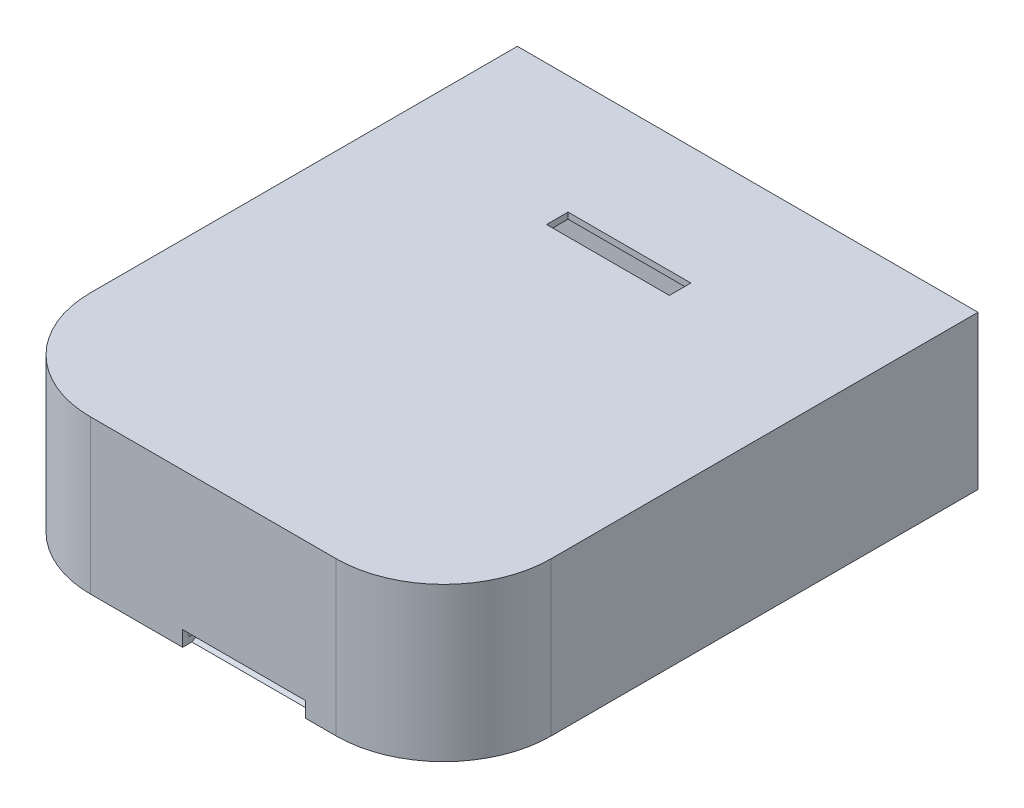
ISO-10303-21;
HEADER;
FILE_DESCRIPTION(('STEP AP214'),'2;1');
FILE_NAME('part.step','',(''),(''),'','','');
FILE_SCHEMA(('AUTOMOTIVE_DESIGN { 1 0 10303 214 1 1 1 1 }'));
ENDSEC;
DATA;
#1=APPLICATION_CONTEXT('core data for automotive mechanical design processes');
#2=APPLICATION_PROTOCOL_DEFINITION('international standard','automotive_design',2000,#1);
#3=PRODUCT_CONTEXT('',#1,'mechanical');
#4=PRODUCT('Part','Part','',(#3));
#5=PRODUCT_RELATED_PRODUCT_CATEGORY('part','',(#4));
#6=PRODUCT_DEFINITION_FORMATION('','',#4);
#7=PRODUCT_DEFINITION_CONTEXT('part definition',#1,'design');
#8=PRODUCT_DEFINITION('design','',#6,#7);
#9=PRODUCT_DEFINITION_SHAPE('','',#8);
#10=(LENGTH_UNIT() NAMED_UNIT(*) SI_UNIT(.MILLI.,.METRE.));
#11=(NAMED_UNIT(*) PLANE_ANGLE_UNIT() SI_UNIT($,.RADIAN.));
#12=(NAMED_UNIT(*) SI_UNIT($,.STERADIAN.) SOLID_ANGLE_UNIT());
#13=UNCERTAINTY_MEASURE_WITH_UNIT(LENGTH_MEASURE(1.E-05),#10,'distance_accuracy_value','');
#14=(GEOMETRIC_REPRESENTATION_CONTEXT(3) GLOBAL_UNCERTAINTY_ASSIGNED_CONTEXT((#13)) GLOBAL_UNIT_ASSIGNED_CONTEXT((#10,
#11,#12)) REPRESENTATION_CONTEXT('',''));
#15=CARTESIAN_POINT('',(0.,0.,0.));
#16=DIRECTION('',(0.,0.,1.));
#17=DIRECTION('',(1.,0.,0.));
#18=AXIS2_PLACEMENT_3D('',#15,#16,#17);
#19=CARTESIAN_POINT('',(-750.,-230.,320.));
#20=DIRECTION('',(0.,1.,0.));
#21=DIRECTION('',(0.,0.,1.));
#22=AXIS2_PLACEMENT_3D('',#19,#20,#21);
#23=PLANE('',#22);
#24=DIRECTION('',(1.,0.,0.));
#25=VECTOR('',#24,1.);
#26=CARTESIAN_POINT('',(-750.,-230.,1355.35898384862));
#27=LINE('',#26,#25);
#28=CARTESIAN_POINT('',(-100.,-230.,1355.35898384862));
#29=VERTEX_POINT('',#28);
#30=CARTESIAN_POINT('',(300.,-230.,1355.35898384862));
#31=VERTEX_POINT('',#30);
#32=EDGE_CURVE('E243',#29,#31,#27,.T.);
#33=ORIENTED_EDGE('',*,*,#32,.T.);
#34=DIRECTION('',(0.,0.,-1.));
#35=VECTOR('',#34,1.);
#36=CARTESIAN_POINT('',(300.,-230.,320.));
#37=LINE('',#36,#35);
#38=CARTESIAN_POINT('',(300.,-230.,1400.));
#39=VERTEX_POINT('',#38);
#40=EDGE_CURVE('E63',#39,#31,#37,.T.);
#41=ORIENTED_EDGE('',*,*,#40,.F.);
#42=DIRECTION('',(1.,0.,0.));
#43=VECTOR('',#42,1.);
#44=CARTESIAN_POINT('',(-750.,-230.,1400.));
#45=LINE('',#44,#43);
#46=CARTESIAN_POINT('',(400.,-230.,1400.));
#47=VERTEX_POINT('',#46);
#48=EDGE_CURVE('E317',#39,#47,#45,.T.);
#49=ORIENTED_EDGE('',*,*,#48,.T.);
#50=CARTESIAN_POINT('',(400.,-230.,1070.));
#51=DIRECTION('',(0.,1.,0.));
#52=DIRECTION('',(0.,0.,1.));
#53=AXIS2_PLACEMENT_3D('',#50,#51,#52);
#54=CIRCLE('',#53,330.);
#55=CARTESIAN_POINT('',(730.,-230.,1070.));
#56=VERTEX_POINT('',#55);
#57=EDGE_CURVE('E309',#47,#56,#54,.T.);
#58=ORIENTED_EDGE('',*,*,#57,.T.);
#59=DIRECTION('',(0.,0.,-1.));
#60=VECTOR('',#59,1.);
#61=CARTESIAN_POINT('',(730.,-230.,320.));
#62=LINE('',#61,#60);
#63=CARTESIAN_POINT('',(730.,-230.,340.));
#64=VERTEX_POINT('',#63);
#65=EDGE_CURVE('E270',#56,#64,#62,.T.);
#66=ORIENTED_EDGE('',*,*,#65,.T.);
#67=DIRECTION('',(1.,0.,0.));
#68=VECTOR('',#67,1.);
#69=CARTESIAN_POINT('',(-750.,-230.,340.));
#70=LINE('',#69,#68);
#71=CARTESIAN_POINT('',(-730.,-230.,340.));
#72=VERTEX_POINT('',#71);
#73=EDGE_CURVE('E265',#72,#64,#70,.T.);
#74=ORIENTED_EDGE('',*,*,#73,.F.);
#75=DIRECTION('',(0.,0.,-1.));
#76=VECTOR('',#75,1.);
#77=CARTESIAN_POINT('',(-730.,-230.,320.));
#78=LINE('',#77,#76);
#79=CARTESIAN_POINT('',(-730.,-230.,1070.));
#80=VERTEX_POINT('',#79);
#81=EDGE_CURVE('E261',#80,#72,#78,.T.);
#82=ORIENTED_EDGE('',*,*,#81,.F.);
#83=CARTESIAN_POINT('',(-400.,-230.,1070.));
#84=DIRECTION('',(0.,1.,0.));
#85=DIRECTION('',(0.,0.,1.));
#86=AXIS2_PLACEMENT_3D('',#83,#84,#85);
#87=CIRCLE('',#86,330.);
#88=CARTESIAN_POINT('',(-400.,-230.,1400.));
#89=VERTEX_POINT('',#88);
#90=EDGE_CURVE('E324',#80,#89,#87,.T.);
#91=ORIENTED_EDGE('',*,*,#90,.T.);
#92=CARTESIAN_POINT('',(-99.9999999999999,-230.,1400.));
#93=VERTEX_POINT('',#92);
#94=EDGE_CURVE('E318',#89,#93,#45,.T.);
#95=ORIENTED_EDGE('',*,*,#94,.T.);
#96=DIRECTION('',(0.,0.,1.));
#97=VECTOR('',#96,1.);
#98=CARTESIAN_POINT('',(-100.,-230.,320.));
#99=LINE('',#98,#97);
#100=EDGE_CURVE('E71',#29,#93,#99,.T.);
#101=ORIENTED_EDGE('',*,*,#100,.F.);
#102=EDGE_LOOP('',(#33,#41,#49,#58,#66,#74,#82,#91,#95,#101));
#103=FACE_BOUND('',#102,.T.);
#104=ADVANCED_FACE('F46',(#103),#23,.T.);
#105=CARTESIAN_POINT('',(730.,250.,320.));
#106=DIRECTION('',(-1.,0.,0.));
#107=DIRECTION('',(0.,0.,1.));
#108=AXIS2_PLACEMENT_3D('',#105,#106,#107);
#109=PLANE('',#108);
#110=ORIENTED_EDGE('',*,*,#65,.F.);
#111=DIRECTION('',(0.,1.,0.));
#112=VECTOR('',#111,1.);
#113=CARTESIAN_POINT('',(730.,-250.,1070.));
#114=LINE('',#113,#112);
#115=CARTESIAN_POINT('',(730.,230.,1070.));
#116=VERTEX_POINT('',#115);
#117=EDGE_CURVE('E313',#56,#116,#114,.T.);
#118=ORIENTED_EDGE('',*,*,#117,.T.);
#119=DIRECTION('',(0.,0.,-1.));
#120=VECTOR('',#119,1.);
#121=CARTESIAN_POINT('',(730.,230.,320.));
#122=LINE('',#121,#120);
#123=CARTESIAN_POINT('',(730.,230.,340.));
#124=VERTEX_POINT('',#123);
#125=EDGE_CURVE('E290',#116,#124,#122,.T.);
#126=ORIENTED_EDGE('',*,*,#125,.T.);
#127=DIRECTION('',(0.,1.,0.));
#128=VECTOR('',#127,1.);
#129=CARTESIAN_POINT('',(730.,-250.,340.));
#130=LINE('',#129,#128);
#131=EDGE_CURVE('E274',#64,#124,#130,.T.);
#132=ORIENTED_EDGE('',*,*,#131,.F.);
#133=EDGE_LOOP('',(#110,#118,#126,#132));
#134=FACE_BOUND('',#133,.T.);
#135=ADVANCED_FACE('F542',(#134),#109,.T.);
#136=CARTESIAN_POINT('',(-730.,250.,320.));
#137=DIRECTION('',(1.,0.,0.));
#138=DIRECTION('',(0.,1.,0.));
#139=AXIS2_PLACEMENT_3D('',#136,#137,#138);
#140=PLANE('',#139);
#141=DIRECTION('',(0.,0.,-1.));
#142=VECTOR('',#141,1.);
#143=CARTESIAN_POINT('',(-730.,230.,320.));
#144=LINE('',#143,#142);
#145=CARTESIAN_POINT('',(-730.,230.,1070.));
#146=VERTEX_POINT('',#145);
#147=CARTESIAN_POINT('',(-730.,230.,340.));
#148=VERTEX_POINT('',#147);
#149=EDGE_CURVE('E278',#146,#148,#144,.T.);
#150=ORIENTED_EDGE('',*,*,#149,.F.);
#151=DIRECTION('',(0.,1.,0.));
#152=VECTOR('',#151,1.);
#153=CARTESIAN_POINT('',(-730.,250.,1070.));
#154=LINE('',#153,#152);
#155=EDGE_CURVE('E286',#80,#146,#154,.T.);
#156=ORIENTED_EDGE('',*,*,#155,.F.);
#157=ORIENTED_EDGE('',*,*,#81,.T.);
#158=DIRECTION('',(0.,-1.,0.));
#159=VECTOR('',#158,1.);
#160=CARTESIAN_POINT('',(-730.,-250.,340.));
#161=LINE('',#160,#159);
#162=EDGE_CURVE('E282',#148,#72,#161,.T.);
#163=ORIENTED_EDGE('',*,*,#162,.F.);
#164=EDGE_LOOP('',(#150,#156,#157,#163));
#165=FACE_BOUND('',#164,.T.);
#166=ADVANCED_FACE('F548',(#165),#140,.T.);
#167=CARTESIAN_POINT('',(-750.,230.,320.));
#168=DIRECTION('',(0.,-1.,0.));
#169=DIRECTION('',(0.,0.,-1.));
#170=AXIS2_PLACEMENT_3D('',#167,#168,#169);
#171=PLANE('',#170);
#172=ORIENTED_EDGE('',*,*,#125,.F.);
#173=CARTESIAN_POINT('',(400.,230.,1070.));
#174=DIRECTION('',(0.,-1.,0.));
#175=DIRECTION('',(0.,0.,-1.));
#176=AXIS2_PLACEMENT_3D('',#173,#174,#175);
#177=CIRCLE('',#176,330.);
#178=CARTESIAN_POINT('',(400.,230.,1400.));
#179=VERTEX_POINT('',#178);
#180=EDGE_CURVE('E305',#179,#116,#177,.F.);
#181=ORIENTED_EDGE('',*,*,#180,.F.);
#182=DIRECTION('',(1.,0.,0.));
#183=VECTOR('',#182,1.);
#184=CARTESIAN_POINT('',(-400.,230.,1400.));
#185=LINE('',#184,#183);
#186=CARTESIAN_POINT('',(-400.,230.,1400.));
#187=VERTEX_POINT('',#186);
#188=EDGE_CURVE('E301',#187,#179,#185,.T.);
#189=ORIENTED_EDGE('',*,*,#188,.F.);
#190=CARTESIAN_POINT('',(-400.,230.,1070.));
#191=DIRECTION('',(0.,-1.,0.));
#192=DIRECTION('',(0.,0.,-1.));
#193=AXIS2_PLACEMENT_3D('',#190,#191,#192);
#194=CIRCLE('',#193,330.);
#195=EDGE_CURVE('E297',#146,#187,#194,.F.);
#196=ORIENTED_EDGE('',*,*,#195,.F.);
#197=ORIENTED_EDGE('',*,*,#149,.T.);
#198=DIRECTION('',(-1.,0.,0.));
#199=VECTOR('',#198,1.);
#200=CARTESIAN_POINT('',(-750.,230.,340.));
#201=LINE('',#200,#199);
#202=EDGE_CURVE('E294',#124,#148,#201,.T.);
#203=ORIENTED_EDGE('',*,*,#202,.F.);
#204=EDGE_LOOP('',(#172,#181,#189,#196,#197,#203));
#205=FACE_BOUND('',#204,.T.);
#206=ADVANCED_FACE('F556',(#205),#171,.T.);
#207=CARTESIAN_POINT('',(-750.,-250.,340.));
#208=DIRECTION('',(0.,0.,-1.));
#209=DIRECTION('',(-1.,0.,0.));
#210=AXIS2_PLACEMENT_3D('',#207,#208,#209);
#211=PLANE('',#210);
#212=ORIENTED_EDGE('',*,*,#73,.T.);
#213=ORIENTED_EDGE('',*,*,#131,.T.);
#214=ORIENTED_EDGE('',*,*,#202,.T.);
#215=ORIENTED_EDGE('',*,*,#162,.T.);
#216=EDGE_LOOP('',(#212,#213,#214,#215));
#217=FACE_BOUND('',#216,.T.);
#218=ADVANCED_FACE('F546',(#217),#211,.F.);
#219=CARTESIAN_POINT('',(400.,-250.,1070.));
#220=DIRECTION('',(0.,1.,0.));
#221=DIRECTION('',(0.,0.,1.));
#222=AXIS2_PLACEMENT_3D('',#219,#220,#221);
#223=CYLINDRICAL_SURFACE('',#222,330.);
#224=ORIENTED_EDGE('',*,*,#180,.T.);
#225=ORIENTED_EDGE('',*,*,#117,.F.);
#226=ORIENTED_EDGE('',*,*,#57,.F.);
#227=DIRECTION('',(0.,1.,0.));
#228=VECTOR('',#227,1.);
#229=CARTESIAN_POINT('',(400.,-250.,1400.));
#230=LINE('',#229,#228);
#231=EDGE_CURVE('E321',#47,#179,#230,.T.);
#232=ORIENTED_EDGE('',*,*,#231,.T.);
#233=EDGE_LOOP('',(#224,#225,#226,#232));
#234=FACE_BOUND('',#233,.T.);
#235=ADVANCED_FACE('F540',(#234),#223,.F.);
#236=CARTESIAN_POINT('',(-400.,-250.,1400.));
#237=DIRECTION('',(0.,0.,1.));
#238=DIRECTION('',(1.,0.,0.));
#239=AXIS2_PLACEMENT_3D('',#236,#237,#238);
#240=PLANE('',#239);
#241=ORIENTED_EDGE('',*,*,#48,.F.);
#242=DIRECTION('',(0.,1.,0.));
#243=VECTOR('',#242,1.);
#244=CARTESIAN_POINT('',(300.,-250.000000000001,1400.));
#245=LINE('',#244,#243);
#246=CARTESIAN_POINT('',(300.,-200.,1400.));
#247=VERTEX_POINT('',#246);
#248=EDGE_CURVE('E245',#39,#247,#245,.T.);
#249=ORIENTED_EDGE('',*,*,#248,.T.);
#250=DIRECTION('',(-1.,0.,0.));
#251=VECTOR('',#250,1.);
#252=CARTESIAN_POINT('',(-400.,-200.,1400.));
#253=LINE('',#252,#251);
#254=CARTESIAN_POINT('',(-100.,-200.,1400.));
#255=VERTEX_POINT('',#254);
#256=EDGE_CURVE('E256',#247,#255,#253,.T.);
#257=ORIENTED_EDGE('',*,*,#256,.T.);
#258=DIRECTION('',(0.,-1.,0.));
#259=VECTOR('',#258,1.);
#260=CARTESIAN_POINT('',(-99.9999999999999,-250.,1400.));
#261=LINE('',#260,#259);
#262=EDGE_CURVE('E250',#255,#93,#261,.T.);
#263=ORIENTED_EDGE('',*,*,#262,.T.);
#264=ORIENTED_EDGE('',*,*,#94,.F.);
#265=DIRECTION('',(0.,1.,0.));
#266=VECTOR('',#265,1.);
#267=CARTESIAN_POINT('',(-400.,-250.,1400.));
#268=LINE('',#267,#266);
#269=EDGE_CURVE('E260',#89,#187,#268,.T.);
#270=ORIENTED_EDGE('',*,*,#269,.T.);
#271=ORIENTED_EDGE('',*,*,#188,.T.);
#272=ORIENTED_EDGE('',*,*,#231,.F.);
#273=EDGE_LOOP('',(#241,#249,#257,#263,#264,#270,#271,#272));
#274=FACE_BOUND('',#273,.T.);
#275=ADVANCED_FACE('F535',(#274),#240,.F.);
#276=CARTESIAN_POINT('',(-400.,-250.,1070.));
#277=DIRECTION('',(0.,1.,0.));
#278=DIRECTION('',(0.,0.,1.));
#279=AXIS2_PLACEMENT_3D('',#276,#277,#278);
#280=CYLINDRICAL_SURFACE('',#279,330.);
#281=ORIENTED_EDGE('',*,*,#195,.T.);
#282=ORIENTED_EDGE('',*,*,#269,.F.);
#283=ORIENTED_EDGE('',*,*,#90,.F.);
#284=ORIENTED_EDGE('',*,*,#155,.T.);
#285=EDGE_LOOP('',(#281,#282,#283,#284));
#286=FACE_BOUND('',#285,.T.);
#287=ADVANCED_FACE('F552',(#286),#280,.F.);
#288=CARTESIAN_POINT('',(300.,-200.,1390.));
#289=DIRECTION('',(0.,1.,0.));
#290=DIRECTION('',(-1.,0.,0.));
#291=AXIS2_PLACEMENT_3D('',#288,#289,#290);
#292=PLANE('',#291);
#293=DIRECTION('',(0.,0.,1.));
#294=VECTOR('',#293,1.);
#295=CARTESIAN_POINT('',(300.,-200.,1390.));
#296=LINE('',#295,#294);
#297=CARTESIAN_POINT('',(300.,-200.,1420.));
#298=VERTEX_POINT('',#297);
#299=EDGE_CURVE('E241',#247,#298,#296,.T.);
#300=ORIENTED_EDGE('',*,*,#299,.T.);
#301=DIRECTION('',(-1.,0.,0.));
#302=VECTOR('',#301,1.);
#303=CARTESIAN_POINT('',(300.,-200.,1420.));
#304=LINE('',#303,#302);
#305=CARTESIAN_POINT('',(-99.9999999999999,-200.,1420.));
#306=VERTEX_POINT('',#305);
#307=EDGE_CURVE('E494',#298,#306,#304,.T.);
#308=ORIENTED_EDGE('',*,*,#307,.T.);
#309=DIRECTION('',(0.,0.,1.));
#310=VECTOR('',#309,1.);
#311=CARTESIAN_POINT('',(-99.9999999999999,-200.,1390.));
#312=LINE('',#311,#310);
#313=EDGE_CURVE('E232',#255,#306,#312,.T.);
#314=ORIENTED_EDGE('',*,*,#313,.F.);
#315=ORIENTED_EDGE('',*,*,#256,.F.);
#316=EDGE_LOOP('',(#300,#308,#314,#315));
#317=FACE_BOUND('',#316,.T.);
#318=ADVANCED_FACE('F506',(#317),#292,.F.);
#319=CARTESIAN_POINT('',(300.,-250.,1390.));
#320=DIRECTION('',(1.,0.,0.));
#321=DIRECTION('',(0.,1.,0.));
#322=AXIS2_PLACEMENT_3D('',#319,#320,#321);
#323=PLANE('',#322);
#324=ORIENTED_EDGE('',*,*,#40,.T.);
#325=DIRECTION('',(0.,0.499999999999993,-0.866025403784443));
#326=VECTOR('',#325,1.);
#327=CARTESIAN_POINT('',(300.,-250.,1390.));
#328=LINE('',#327,#326);
#329=CARTESIAN_POINT('',(300.,-250.,1390.));
#330=VERTEX_POINT('',#329);
#331=EDGE_CURVE('E56',#31,#330,#328,.F.);
#332=ORIENTED_EDGE('',*,*,#331,.T.);
#333=DIRECTION('',(0.,0.,1.));
#334=VECTOR('',#333,1.);
#335=CARTESIAN_POINT('',(300.,-250.,1390.));
#336=LINE('',#335,#334);
#337=CARTESIAN_POINT('',(300.,-250.,1420.));
#338=VERTEX_POINT('',#337);
#339=EDGE_CURVE('E231',#330,#338,#336,.T.);
#340=ORIENTED_EDGE('',*,*,#339,.T.);
#341=DIRECTION('',(0.,1.,0.));
#342=VECTOR('',#341,1.);
#343=CARTESIAN_POINT('',(300.,-250.,1420.));
#344=LINE('',#343,#342);
#345=EDGE_CURVE('E498',#338,#298,#344,.T.);
#346=ORIENTED_EDGE('',*,*,#345,.T.);
#347=ORIENTED_EDGE('',*,*,#299,.F.);
#348=ORIENTED_EDGE('',*,*,#248,.F.);
#349=EDGE_LOOP('',(#324,#332,#340,#346,#347,#348));
#350=FACE_BOUND('',#349,.T.);
#351=ADVANCED_FACE('F502',(#350),#323,.F.);
#352=CARTESIAN_POINT('',(-99.9999999999999,-250.,1390.));
#353=DIRECTION('',(-1.,0.,0.));
#354=DIRECTION('',(0.,-1.,0.));
#355=AXIS2_PLACEMENT_3D('',#352,#353,#354);
#356=PLANE('',#355);
#357=ORIENTED_EDGE('',*,*,#100,.T.);
#358=ORIENTED_EDGE('',*,*,#262,.F.);
#359=ORIENTED_EDGE('',*,*,#313,.T.);
#360=DIRECTION('',(0.,-1.,0.));
#361=VECTOR('',#360,1.);
#362=CARTESIAN_POINT('',(-99.9999999999999,-250.,1420.));
#363=LINE('',#362,#361);
#364=CARTESIAN_POINT('',(-99.9999999999999,-250.,1420.));
#365=VERTEX_POINT('',#364);
#366=EDGE_CURVE('E226',#306,#365,#363,.T.);
#367=ORIENTED_EDGE('',*,*,#366,.T.);
#368=DIRECTION('',(0.,0.,1.));
#369=VECTOR('',#368,1.);
#370=CARTESIAN_POINT('',(-99.9999999999999,-250.,1390.));
#371=LINE('',#370,#369);
#372=CARTESIAN_POINT('',(-99.9999999999999,-250.,1390.));
#373=VERTEX_POINT('',#372);
#374=EDGE_CURVE('E220',#373,#365,#371,.T.);
#375=ORIENTED_EDGE('',*,*,#374,.F.);
#376=DIRECTION('',(0.,-0.499999999999993,0.866025403784443));
#377=VECTOR('',#376,1.);
#378=CARTESIAN_POINT('',(-99.9999999999999,-250.,1390.));
#379=LINE('',#378,#377);
#380=EDGE_CURVE('E11',#373,#29,#379,.F.);
#381=ORIENTED_EDGE('',*,*,#380,.T.);
#382=EDGE_LOOP('',(#357,#358,#359,#367,#375,#381));
#383=FACE_BOUND('',#382,.T.);
#384=ADVANCED_FACE('F222',(#383),#356,.F.);
#385=CARTESIAN_POINT('',(750.,250.,320.));
#386=DIRECTION('',(-1.,0.,0.));
#387=DIRECTION('',(0.,0.,1.));
#388=AXIS2_PLACEMENT_3D('',#385,#386,#387);
#389=PLANE('',#388);
#390=DIRECTION('',(0.,1.,0.));
#391=VECTOR('',#390,1.);
#392=CARTESIAN_POINT('',(750.,250.,-320.));
#393=LINE('',#392,#391);
#394=CARTESIAN_POINT('',(750.,-250.,-320.));
#395=VERTEX_POINT('',#394);
#396=CARTESIAN_POINT('',(750.,250.,-320.));
#397=VERTEX_POINT('',#396);
#398=EDGE_CURVE('E395',#395,#397,#393,.T.);
#399=ORIENTED_EDGE('',*,*,#398,.T.);
#400=DIRECTION('',(0.,0.,-1.));
#401=VECTOR('',#400,1.);
#402=CARTESIAN_POINT('',(750.,250.,320.));
#403=LINE('',#402,#401);
#404=CARTESIAN_POINT('',(750.,250.,1070.));
#405=VERTEX_POINT('',#404);
#406=EDGE_CURVE('E348',#405,#397,#403,.T.);
#407=ORIENTED_EDGE('',*,*,#406,.F.);
#408=DIRECTION('',(0.,1.,0.));
#409=VECTOR('',#408,1.);
#410=CARTESIAN_POINT('',(750.,-250.,1070.));
#411=LINE('',#410,#409);
#412=CARTESIAN_POINT('',(750.,-250.,1070.));
#413=VERTEX_POINT('',#412);
#414=EDGE_CURVE('E443',#413,#405,#411,.T.);
#415=ORIENTED_EDGE('',*,*,#414,.F.);
#416=DIRECTION('',(0.,0.,-1.));
#417=VECTOR('',#416,1.);
#418=CARTESIAN_POINT('',(750.,-250.,320.));
#419=LINE('',#418,#417);
#420=EDGE_CURVE('E382',#413,#395,#419,.T.);
#421=ORIENTED_EDGE('',*,*,#420,.T.);
#422=EDGE_LOOP('',(#399,#407,#415,#421));
#423=FACE_BOUND('',#422,.T.);
#424=ADVANCED_FACE('F522',(#423),#389,.F.);
#425=CARTESIAN_POINT('',(-750.,250.,320.));
#426=DIRECTION('',(0.,-1.,0.));
#427=DIRECTION('',(0.,0.,-1.));
#428=AXIS2_PLACEMENT_3D('',#425,#426,#427);
#429=PLANE('',#428);
#430=DIRECTION('',(-1.,0.,0.));
#431=VECTOR('',#430,1.);
#432=CARTESIAN_POINT('',(-200.,250.,65.));
#433=LINE('',#432,#431);
#434=CARTESIAN_POINT('',(200.,250.,65.));
#435=VERTEX_POINT('',#434);
#436=CARTESIAN_POINT('',(-200.,250.,65.));
#437=VERTEX_POINT('',#436);
#438=EDGE_CURVE('E420',#435,#437,#433,.T.);
#439=ORIENTED_EDGE('',*,*,#438,.F.);
#440=DIRECTION('',(0.,0.,-1.));
#441=VECTOR('',#440,1.);
#442=CARTESIAN_POINT('',(200.,250.,65.));
#443=LINE('',#442,#441);
#444=CARTESIAN_POINT('',(200.,250.,135.));
#445=VERTEX_POINT('',#444);
#446=EDGE_CURVE('E424',#445,#435,#443,.T.);
#447=ORIENTED_EDGE('',*,*,#446,.F.);
#448=DIRECTION('',(1.,0.,0.));
#449=VECTOR('',#448,1.);
#450=CARTESIAN_POINT('',(-200.,250.,135.));
#451=LINE('',#450,#449);
#452=CARTESIAN_POINT('',(-200.,250.,135.));
#453=VERTEX_POINT('',#452);
#454=EDGE_CURVE('E405',#453,#445,#451,.T.);
#455=ORIENTED_EDGE('',*,*,#454,.F.);
#456=DIRECTION('',(0.,0.,1.));
#457=VECTOR('',#456,1.);
#458=CARTESIAN_POINT('',(-200.,250.,65.));
#459=LINE('',#458,#457);
#460=EDGE_CURVE('E416',#437,#453,#459,.T.);
#461=ORIENTED_EDGE('',*,*,#460,.F.);
#462=EDGE_LOOP('',(#439,#447,#455,#461));
#463=FACE_BOUND('',#462,.T.);
#464=DIRECTION('',(-1.,0.,0.));
#465=VECTOR('',#464,1.);
#466=CARTESIAN_POINT('',(-750.,250.,-320.));
#467=LINE('',#466,#465);
#468=CARTESIAN_POINT('',(-750.,250.,-320.));
#469=VERTEX_POINT('',#468);
#470=EDGE_CURVE('E392',#397,#469,#467,.T.);
#471=ORIENTED_EDGE('',*,*,#470,.T.);
#472=DIRECTION('',(0.,0.,-1.));
#473=VECTOR('',#472,1.);
#474=CARTESIAN_POINT('',(-750.,250.,320.));
#475=LINE('',#474,#473);
#476=CARTESIAN_POINT('',(-750.,250.,1070.));
#477=VERTEX_POINT('',#476);
#478=EDGE_CURVE('E374',#477,#469,#475,.T.);
#479=ORIENTED_EDGE('',*,*,#478,.F.);
#480=CARTESIAN_POINT('',(-400.,250.,1070.));
#481=DIRECTION('',(0.,1.,0.));
#482=DIRECTION('',(0.,0.,-1.));
#483=AXIS2_PLACEMENT_3D('',#480,#481,#482);
#484=CIRCLE('',#483,350.);
#485=CARTESIAN_POINT('',(-400.,250.,1420.));
#486=VERTEX_POINT('',#485);
#487=EDGE_CURVE('E467',#477,#486,#484,.T.);
#488=ORIENTED_EDGE('',*,*,#487,.T.);
#489=DIRECTION('',(1.,0.,0.));
#490=VECTOR('',#489,1.);
#491=CARTESIAN_POINT('',(-400.,250.,1420.));
#492=LINE('',#491,#490);
#493=CARTESIAN_POINT('',(400.,250.,1420.));
#494=VERTEX_POINT('',#493);
#495=EDGE_CURVE('E463',#486,#494,#492,.T.);
#496=ORIENTED_EDGE('',*,*,#495,.T.);
#497=CARTESIAN_POINT('',(400.,250.,1070.));
#498=DIRECTION('',(0.,1.,0.));
#499=DIRECTION('',(0.,0.,-1.));
#500=AXIS2_PLACEMENT_3D('',#497,#498,#499);
#501=CIRCLE('',#500,350.);
#502=EDGE_CURVE('E458',#494,#405,#501,.T.);
#503=ORIENTED_EDGE('',*,*,#502,.T.);
#504=ORIENTED_EDGE('',*,*,#406,.T.);
#505=EDGE_LOOP('',(#471,#479,#488,#496,#503,#504));
#506=FACE_BOUND('',#505,.T.);
#507=ADVANCED_FACE('F596',(#463,#506),#429,.F.);
#508=CARTESIAN_POINT('',(-750.,250.,320.));
#509=DIRECTION('',(1.,0.,0.));
#510=DIRECTION('',(0.,1.,0.));
#511=AXIS2_PLACEMENT_3D('',#508,#509,#510);
#512=PLANE('',#511);
#513=DIRECTION('',(0.,-1.,0.));
#514=VECTOR('',#513,1.);
#515=CARTESIAN_POINT('',(-750.,250.,-320.));
#516=LINE('',#515,#514);
#517=CARTESIAN_POINT('',(-750.,-250.,-320.));
#518=VERTEX_POINT('',#517);
#519=EDGE_CURVE('E389',#469,#518,#516,.T.);
#520=ORIENTED_EDGE('',*,*,#519,.T.);
#521=DIRECTION('',(0.,0.,-1.));
#522=VECTOR('',#521,1.);
#523=CARTESIAN_POINT('',(-750.,-250.,320.));
#524=LINE('',#523,#522);
#525=CARTESIAN_POINT('',(-750.,-250.,1070.));
#526=VERTEX_POINT('',#525);
#527=EDGE_CURVE('E378',#526,#518,#524,.T.);
#528=ORIENTED_EDGE('',*,*,#527,.F.);
#529=DIRECTION('',(0.,1.,0.));
#530=VECTOR('',#529,1.);
#531=CARTESIAN_POINT('',(-750.,-250.,1070.));
#532=LINE('',#531,#530);
#533=EDGE_CURVE('E444',#526,#477,#532,.T.);
#534=ORIENTED_EDGE('',*,*,#533,.T.);
#535=ORIENTED_EDGE('',*,*,#478,.T.);
#536=EDGE_LOOP('',(#520,#528,#534,#535));
#537=FACE_BOUND('',#536,.T.);
#538=ADVANCED_FACE('F515',(#537),#512,.F.);
#539=CARTESIAN_POINT('',(-750.,-250.,320.));
#540=DIRECTION('',(0.,1.,0.));
#541=DIRECTION('',(0.,0.,1.));
#542=AXIS2_PLACEMENT_3D('',#539,#540,#541);
#543=PLANE('',#542);
#544=DIRECTION('',(1.,0.,0.));
#545=VECTOR('',#544,1.);
#546=CARTESIAN_POINT('',(-400.,-250.,1420.));
#547=LINE('',#546,#545);
#548=CARTESIAN_POINT('',(400.,-250.,1420.));
#549=VERTEX_POINT('',#548);
#550=EDGE_CURVE('E477',#338,#549,#547,.T.);
#551=ORIENTED_EDGE('',*,*,#550,.F.);
#552=ORIENTED_EDGE('',*,*,#339,.F.);
#553=DIRECTION('',(1.,0.,0.));
#554=VECTOR('',#553,1.);
#555=CARTESIAN_POINT('',(300.,-250.,1390.));
#556=LINE('',#555,#554);
#557=EDGE_CURVE('E236',#373,#330,#556,.T.);
#558=ORIENTED_EDGE('',*,*,#557,.F.);
#559=ORIENTED_EDGE('',*,*,#374,.T.);
#560=CARTESIAN_POINT('',(-400.,-250.,1420.));
#561=VERTEX_POINT('',#560);
#562=EDGE_CURVE('E474',#561,#365,#547,.T.);
#563=ORIENTED_EDGE('',*,*,#562,.F.);
#564=CARTESIAN_POINT('',(-400.,-250.,1070.));
#565=DIRECTION('',(0.,1.,0.));
#566=DIRECTION('',(0.,0.,-1.));
#567=AXIS2_PLACEMENT_3D('',#564,#565,#566);
#568=CIRCLE('',#567,350.);
#569=EDGE_CURVE('E462',#526,#561,#568,.T.);
#570=ORIENTED_EDGE('',*,*,#569,.F.);
#571=ORIENTED_EDGE('',*,*,#527,.T.);
#572=DIRECTION('',(1.,0.,0.));
#573=VECTOR('',#572,1.);
#574=CARTESIAN_POINT('',(-750.,-250.,-320.));
#575=LINE('',#574,#573);
#576=EDGE_CURVE('E386',#518,#395,#575,.T.);
#577=ORIENTED_EDGE('',*,*,#576,.T.);
#578=ORIENTED_EDGE('',*,*,#420,.F.);
#579=CARTESIAN_POINT('',(400.,-250.,1070.));
#580=DIRECTION('',(0.,1.,0.));
#581=DIRECTION('',(0.,0.,-1.));
#582=AXIS2_PLACEMENT_3D('',#579,#580,#581);
#583=CIRCLE('',#582,350.);
#584=EDGE_CURVE('E449',#549,#413,#583,.T.);
#585=ORIENTED_EDGE('',*,*,#584,.F.);
#586=EDGE_LOOP('',(#551,#552,#558,#559,#563,#570,#571,#577,#578,#585));
#587=FACE_BOUND('',#586,.T.);
#588=ADVANCED_FACE('F238',(#587),#543,.F.);
#589=CARTESIAN_POINT('',(0.,0.,-320.));
#590=DIRECTION('',(0.,0.,1.));
#591=DIRECTION('',(1.,0.,0.));
#592=AXIS2_PLACEMENT_3D('',#589,#590,#591);
#593=PLANE('',#592);
#594=ORIENTED_EDGE('',*,*,#398,.F.);
#595=ORIENTED_EDGE('',*,*,#576,.F.);
#596=ORIENTED_EDGE('',*,*,#519,.F.);
#597=ORIENTED_EDGE('',*,*,#470,.F.);
#598=EDGE_LOOP('',(#594,#595,#596,#597));
#599=FACE_BOUND('',#598,.T.);
#600=ADVANCED_FACE('F520',(#599),#593,.F.);
#601=CARTESIAN_POINT('',(200.,220.,65.));
#602=DIRECTION('',(1.,0.,0.));
#603=DIRECTION('',(0.,0.,-1.));
#604=AXIS2_PLACEMENT_3D('',#601,#602,#603);
#605=PLANE('',#604);
#606=DIRECTION('',(0.,0.,1.));
#607=VECTOR('',#606,1.);
#608=CARTESIAN_POINT('',(200.,230.,320.));
#609=LINE('',#608,#607);
#610=CARTESIAN_POINT('',(200.,230.,65.));
#611=VERTEX_POINT('',#610);
#612=CARTESIAN_POINT('',(200.,230.,135.));
#613=VERTEX_POINT('',#612);
#614=EDGE_CURVE('E266',#611,#613,#609,.T.);
#615=ORIENTED_EDGE('',*,*,#614,.T.);
#616=DIRECTION('',(0.,1.,0.));
#617=VECTOR('',#616,1.);
#618=CARTESIAN_POINT('',(200.,220.,135.));
#619=LINE('',#618,#617);
#620=EDGE_CURVE('E399',#613,#445,#619,.T.);
#621=ORIENTED_EDGE('',*,*,#620,.T.);
#622=ORIENTED_EDGE('',*,*,#446,.T.);
#623=DIRECTION('',(0.,1.,0.));
#624=VECTOR('',#623,1.);
#625=CARTESIAN_POINT('',(200.,220.,65.));
#626=LINE('',#625,#624);
#627=EDGE_CURVE('E400',#611,#435,#626,.T.);
#628=ORIENTED_EDGE('',*,*,#627,.F.);
#629=EDGE_LOOP('',(#615,#621,#622,#628));
#630=FACE_BOUND('',#629,.T.);
#631=ADVANCED_FACE('F606',(#630),#605,.F.);
#632=CARTESIAN_POINT('',(-200.,220.,135.));
#633=DIRECTION('',(0.,0.,1.));
#634=DIRECTION('',(1.,0.,0.));
#635=AXIS2_PLACEMENT_3D('',#632,#633,#634);
#636=PLANE('',#635);
#637=DIRECTION('',(-1.,0.,0.));
#638=VECTOR('',#637,1.);
#639=CARTESIAN_POINT('',(-750.,230.,135.));
#640=LINE('',#639,#638);
#641=CARTESIAN_POINT('',(-200.,230.,135.));
#642=VERTEX_POINT('',#641);
#643=EDGE_CURVE('E332',#613,#642,#640,.T.);
#644=ORIENTED_EDGE('',*,*,#643,.T.);
#645=DIRECTION('',(0.,1.,0.));
#646=VECTOR('',#645,1.);
#647=CARTESIAN_POINT('',(-200.,220.,135.));
#648=LINE('',#647,#646);
#649=EDGE_CURVE('E408',#642,#453,#648,.T.);
#650=ORIENTED_EDGE('',*,*,#649,.T.);
#651=ORIENTED_EDGE('',*,*,#454,.T.);
#652=ORIENTED_EDGE('',*,*,#620,.F.);
#653=EDGE_LOOP('',(#644,#650,#651,#652));
#654=FACE_BOUND('',#653,.T.);
#655=ADVANCED_FACE('F609',(#654),#636,.F.);
#656=CARTESIAN_POINT('',(-200.,220.,65.));
#657=DIRECTION('',(-1.,0.,0.));
#658=DIRECTION('',(0.,0.,1.));
#659=AXIS2_PLACEMENT_3D('',#656,#657,#658);
#660=PLANE('',#659);
#661=DIRECTION('',(0.,0.,-1.));
#662=VECTOR('',#661,1.);
#663=CARTESIAN_POINT('',(-200.,230.,320.));
#664=LINE('',#663,#662);
#665=CARTESIAN_POINT('',(-200.,230.,65.));
#666=VERTEX_POINT('',#665);
#667=EDGE_CURVE('E335',#642,#666,#664,.T.);
#668=ORIENTED_EDGE('',*,*,#667,.T.);
#669=DIRECTION('',(0.,1.,0.));
#670=VECTOR('',#669,1.);
#671=CARTESIAN_POINT('',(-200.,220.,65.));
#672=LINE('',#671,#670);
#673=EDGE_CURVE('E404',#666,#437,#672,.T.);
#674=ORIENTED_EDGE('',*,*,#673,.T.);
#675=ORIENTED_EDGE('',*,*,#460,.T.);
#676=ORIENTED_EDGE('',*,*,#649,.F.);
#677=EDGE_LOOP('',(#668,#674,#675,#676));
#678=FACE_BOUND('',#677,.T.);
#679=ADVANCED_FACE('F613',(#678),#660,.F.);
#680=CARTESIAN_POINT('',(-200.,220.,65.));
#681=DIRECTION('',(0.,0.,-1.));
#682=DIRECTION('',(-1.,0.,0.));
#683=AXIS2_PLACEMENT_3D('',#680,#681,#682);
#684=PLANE('',#683);
#685=DIRECTION('',(1.,0.,0.));
#686=VECTOR('',#685,1.);
#687=CARTESIAN_POINT('',(-750.,230.,65.));
#688=LINE('',#687,#686);
#689=EDGE_CURVE('E339',#666,#611,#688,.T.);
#690=ORIENTED_EDGE('',*,*,#689,.T.);
#691=ORIENTED_EDGE('',*,*,#627,.T.);
#692=ORIENTED_EDGE('',*,*,#438,.T.);
#693=ORIENTED_EDGE('',*,*,#673,.F.);
#694=EDGE_LOOP('',(#690,#691,#692,#693));
#695=FACE_BOUND('',#694,.T.);
#696=ADVANCED_FACE('F592',(#695),#684,.F.);
#697=CARTESIAN_POINT('',(730.,250.,320.));
#698=DIRECTION('',(-1.,0.,0.));
#699=DIRECTION('',(0.,0.,1.));
#700=AXIS2_PLACEMENT_3D('',#697,#698,#699);
#701=PLANE('',#700);
#702=DIRECTION('',(0.,0.,-1.));
#703=VECTOR('',#702,1.);
#704=CARTESIAN_POINT('',(730.,230.,320.));
#705=LINE('',#704,#703);
#706=CARTESIAN_POINT('',(730.,230.,320.));
#707=VERTEX_POINT('',#706);
#708=CARTESIAN_POINT('',(730.,230.,-300.));
#709=VERTEX_POINT('',#708);
#710=EDGE_CURVE('E355',#707,#709,#705,.T.);
#711=ORIENTED_EDGE('',*,*,#710,.T.);
#712=DIRECTION('',(0.,1.,0.));
#713=VECTOR('',#712,1.);
#714=CARTESIAN_POINT('',(730.,250.,-300.));
#715=LINE('',#714,#713);
#716=CARTESIAN_POINT('',(730.,-230.,-300.));
#717=VERTEX_POINT('',#716);
#718=EDGE_CURVE('E343',#717,#709,#715,.T.);
#719=ORIENTED_EDGE('',*,*,#718,.F.);
#720=DIRECTION('',(0.,0.,-1.));
#721=VECTOR('',#720,1.);
#722=CARTESIAN_POINT('',(730.,-230.,320.));
#723=LINE('',#722,#721);
#724=CARTESIAN_POINT('',(730.,-230.,320.));
#725=VERTEX_POINT('',#724);
#726=EDGE_CURVE('E347',#725,#717,#723,.T.);
#727=ORIENTED_EDGE('',*,*,#726,.F.);
#728=DIRECTION('',(0.,1.,0.));
#729=VECTOR('',#728,1.);
#730=CARTESIAN_POINT('',(730.,230.,320.));
#731=LINE('',#730,#729);
#732=EDGE_CURVE('E431',#725,#707,#731,.T.);
#733=ORIENTED_EDGE('',*,*,#732,.T.);
#734=EDGE_LOOP('',(#711,#719,#727,#733));
#735=FACE_BOUND('',#734,.T.);
#736=ADVANCED_FACE('F588',(#735),#701,.T.);
#737=CARTESIAN_POINT('',(-750.,230.,320.));
#738=DIRECTION('',(0.,-1.,0.));
#739=DIRECTION('',(0.,0.,-1.));
#740=AXIS2_PLACEMENT_3D('',#737,#738,#739);
#741=PLANE('',#740);
#742=DIRECTION('',(0.,0.,-1.));
#743=VECTOR('',#742,1.);
#744=CARTESIAN_POINT('',(-730.,230.,320.));
#745=LINE('',#744,#743);
#746=CARTESIAN_POINT('',(-730.,230.,320.));
#747=VERTEX_POINT('',#746);
#748=CARTESIAN_POINT('',(-730.,230.,-300.));
#749=VERTEX_POINT('',#748);
#750=EDGE_CURVE('E362',#747,#749,#745,.T.);
#751=ORIENTED_EDGE('',*,*,#750,.T.);
#752=DIRECTION('',(-1.,0.,0.));
#753=VECTOR('',#752,1.);
#754=CARTESIAN_POINT('',(-750.,230.,-300.));
#755=LINE('',#754,#753);
#756=EDGE_CURVE('E351',#709,#749,#755,.T.);
#757=ORIENTED_EDGE('',*,*,#756,.F.);
#758=ORIENTED_EDGE('',*,*,#710,.F.);
#759=DIRECTION('',(-1.,0.,0.));
#760=VECTOR('',#759,1.);
#761=CARTESIAN_POINT('',(-730.,230.,320.));
#762=LINE('',#761,#760);
#763=EDGE_CURVE('E427',#707,#747,#762,.T.);
#764=ORIENTED_EDGE('',*,*,#763,.T.);
#765=EDGE_LOOP('',(#751,#757,#758,#764));
#766=FACE_BOUND('',#765,.T.);
#767=ORIENTED_EDGE('',*,*,#614,.F.);
#768=ORIENTED_EDGE('',*,*,#689,.F.);
#769=ORIENTED_EDGE('',*,*,#667,.F.);
#770=ORIENTED_EDGE('',*,*,#643,.F.);
#771=EDGE_LOOP('',(#767,#768,#769,#770));
#772=FACE_BOUND('',#771,.T.);
#773=ADVANCED_FACE('F584',(#766,#772),#741,.T.);
#774=CARTESIAN_POINT('',(-730.,250.,320.));
#775=DIRECTION('',(1.,0.,0.));
#776=DIRECTION('',(0.,1.,0.));
#777=AXIS2_PLACEMENT_3D('',#774,#775,#776);
#778=PLANE('',#777);
#779=DIRECTION('',(0.,0.,-1.));
#780=VECTOR('',#779,1.);
#781=CARTESIAN_POINT('',(-730.,-230.,320.));
#782=LINE('',#781,#780);
#783=CARTESIAN_POINT('',(-730.,-230.,320.));
#784=VERTEX_POINT('',#783);
#785=CARTESIAN_POINT('',(-730.,-230.,-300.));
#786=VERTEX_POINT('',#785);
#787=EDGE_CURVE('E342',#784,#786,#782,.T.);
#788=ORIENTED_EDGE('',*,*,#787,.T.);
#789=DIRECTION('',(0.,-1.,0.));
#790=VECTOR('',#789,1.);
#791=CARTESIAN_POINT('',(-730.,250.,-300.));
#792=LINE('',#791,#790);
#793=EDGE_CURVE('E358',#749,#786,#792,.T.);
#794=ORIENTED_EDGE('',*,*,#793,.F.);
#795=ORIENTED_EDGE('',*,*,#750,.F.);
#796=DIRECTION('',(0.,-1.,0.));
#797=VECTOR('',#796,1.);
#798=CARTESIAN_POINT('',(-730.,230.,320.));
#799=LINE('',#798,#797);
#800=EDGE_CURVE('E439',#747,#784,#799,.T.);
#801=ORIENTED_EDGE('',*,*,#800,.T.);
#802=EDGE_LOOP('',(#788,#794,#795,#801));
#803=FACE_BOUND('',#802,.T.);
#804=ADVANCED_FACE('F580',(#803),#778,.T.);
#805=CARTESIAN_POINT('',(-750.,-230.,320.));
#806=DIRECTION('',(0.,1.,0.));
#807=DIRECTION('',(0.,0.,1.));
#808=AXIS2_PLACEMENT_3D('',#805,#806,#807);
#809=PLANE('',#808);
#810=ORIENTED_EDGE('',*,*,#726,.T.);
#811=DIRECTION('',(1.,0.,0.));
#812=VECTOR('',#811,1.);
#813=CARTESIAN_POINT('',(-750.,-230.,-300.));
#814=LINE('',#813,#812);
#815=EDGE_CURVE('E365',#786,#717,#814,.T.);
#816=ORIENTED_EDGE('',*,*,#815,.F.);
#817=ORIENTED_EDGE('',*,*,#787,.F.);
#818=DIRECTION('',(1.,0.,0.));
#819=VECTOR('',#818,1.);
#820=CARTESIAN_POINT('',(-730.,-230.,320.));
#821=LINE('',#820,#819);
#822=EDGE_CURVE('E435',#784,#725,#821,.T.);
#823=ORIENTED_EDGE('',*,*,#822,.T.);
#824=EDGE_LOOP('',(#810,#816,#817,#823));
#825=FACE_BOUND('',#824,.T.);
#826=ADVANCED_FACE('F576',(#825),#809,.T.);
#827=CARTESIAN_POINT('',(0.,0.,-300.));
#828=DIRECTION('',(0.,0.,1.));
#829=DIRECTION('',(1.,0.,0.));
#830=AXIS2_PLACEMENT_3D('',#827,#828,#829);
#831=PLANE('',#830);
#832=ORIENTED_EDGE('',*,*,#718,.T.);
#833=ORIENTED_EDGE('',*,*,#756,.T.);
#834=ORIENTED_EDGE('',*,*,#793,.T.);
#835=ORIENTED_EDGE('',*,*,#815,.T.);
#836=EDGE_LOOP('',(#832,#833,#834,#835));
#837=FACE_BOUND('',#836,.T.);
#838=ADVANCED_FACE('F572',(#837),#831,.T.);
#839=CARTESIAN_POINT('',(-750.,-250.,320.));
#840=DIRECTION('',(0.,0.,-1.));
#841=DIRECTION('',(-1.,0.,0.));
#842=AXIS2_PLACEMENT_3D('',#839,#840,#841);
#843=PLANE('',#842);
#844=ORIENTED_EDGE('',*,*,#800,.F.);
#845=ORIENTED_EDGE('',*,*,#763,.F.);
#846=ORIENTED_EDGE('',*,*,#732,.F.);
#847=ORIENTED_EDGE('',*,*,#822,.F.);
#848=EDGE_LOOP('',(#844,#845,#846,#847));
#849=FACE_BOUND('',#848,.T.);
#850=ADVANCED_FACE('F575',(#849),#843,.T.);
#851=CARTESIAN_POINT('',(400.,-250.,1070.));
#852=DIRECTION('',(0.,1.,0.));
#853=DIRECTION('',(0.,0.,1.));
#854=AXIS2_PLACEMENT_3D('',#851,#852,#853);
#855=CYLINDRICAL_SURFACE('',#854,350.);
#856=ORIENTED_EDGE('',*,*,#502,.F.);
#857=DIRECTION('',(0.,1.,0.));
#858=VECTOR('',#857,1.);
#859=CARTESIAN_POINT('',(400.,-250.,1420.));
#860=LINE('',#859,#858);
#861=EDGE_CURVE('E452',#549,#494,#860,.T.);
#862=ORIENTED_EDGE('',*,*,#861,.F.);
#863=ORIENTED_EDGE('',*,*,#584,.T.);
#864=ORIENTED_EDGE('',*,*,#414,.T.);
#865=EDGE_LOOP('',(#856,#862,#863,#864));
#866=FACE_BOUND('',#865,.T.);
#867=ADVANCED_FACE('F528',(#866),#855,.T.);
#868=CARTESIAN_POINT('',(-400.,-250.,1420.));
#869=DIRECTION('',(0.,0.,1.));
#870=DIRECTION('',(1.,0.,0.));
#871=AXIS2_PLACEMENT_3D('',#868,#869,#870);
#872=PLANE('',#871);
#873=ORIENTED_EDGE('',*,*,#345,.F.);
#874=ORIENTED_EDGE('',*,*,#550,.T.);
#875=ORIENTED_EDGE('',*,*,#861,.T.);
#876=ORIENTED_EDGE('',*,*,#495,.F.);
#877=DIRECTION('',(0.,1.,0.));
#878=VECTOR('',#877,1.);
#879=CARTESIAN_POINT('',(-400.,-250.,1420.));
#880=LINE('',#879,#878);
#881=EDGE_CURVE('E448',#561,#486,#880,.T.);
#882=ORIENTED_EDGE('',*,*,#881,.F.);
#883=ORIENTED_EDGE('',*,*,#562,.T.);
#884=ORIENTED_EDGE('',*,*,#366,.F.);
#885=ORIENTED_EDGE('',*,*,#307,.F.);
#886=EDGE_LOOP('',(#873,#874,#875,#876,#882,#883,#884,#885));
#887=FACE_BOUND('',#886,.T.);
#888=ADVANCED_FACE('F507',(#887),#872,.T.);
#889=CARTESIAN_POINT('',(-400.,-250.,1070.));
#890=DIRECTION('',(0.,1.,0.));
#891=DIRECTION('',(0.,0.,1.));
#892=AXIS2_PLACEMENT_3D('',#889,#890,#891);
#893=CYLINDRICAL_SURFACE('',#892,350.);
#894=ORIENTED_EDGE('',*,*,#487,.F.);
#895=ORIENTED_EDGE('',*,*,#533,.F.);
#896=ORIENTED_EDGE('',*,*,#569,.T.);
#897=ORIENTED_EDGE('',*,*,#881,.T.);
#898=EDGE_LOOP('',(#894,#895,#896,#897));
#899=FACE_BOUND('',#898,.T.);
#900=ADVANCED_FACE('F513',(#899),#893,.T.);
#901=CARTESIAN_POINT('',(-750.,-230.,1355.35898384862));
#902=DIRECTION('',(0.,-0.866025403784443,-0.499999999999993));
#903=DIRECTION('',(1.,0.,0.));
#904=AXIS2_PLACEMENT_3D('',#901,#902,#903);
#905=PLANE('',#904);
#906=ORIENTED_EDGE('',*,*,#380,.F.);
#907=ORIENTED_EDGE('',*,*,#557,.T.);
#908=ORIENTED_EDGE('',*,*,#331,.F.);
#909=ORIENTED_EDGE('',*,*,#32,.F.);
#910=EDGE_LOOP('',(#906,#907,#908,#909));
#911=FACE_BOUND('',#910,.T.);
#912=ADVANCED_FACE('F49',(#911),#905,.F.);
#913=CLOSED_SHELL('',(#104,#135,#166,#206,#218,#235,#275,#287,#318,#351,#384,#424,#507,#538,
#588,#600,#631,#655,#679,#696,#736,#773,#804,#826,#838,#850,#867,#888,#900,#912));
#914=MANIFOLD_SOLID_BREP('B2',#913);
#915=ADVANCED_BREP_SHAPE_REPRESENTATION('',(#18,#914),#14);
#916=SHAPE_DEFINITION_REPRESENTATION(#9,#915);
ENDSEC;
END-ISO-10303-21;
